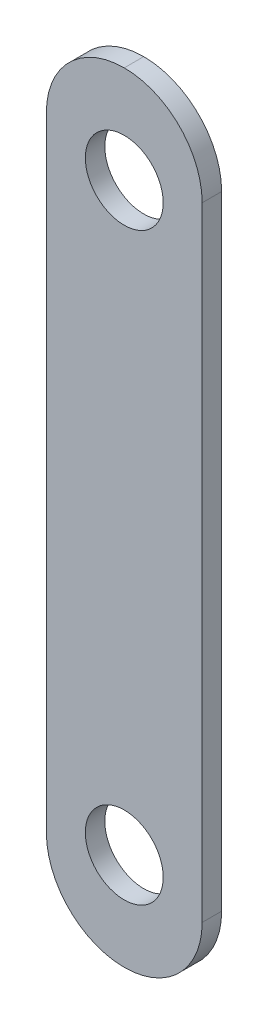
ISO-10303-21;
HEADER;
FILE_DESCRIPTION(('STEP AP214'),'2;1');
FILE_NAME('part.step','',(''),(''),'','','');
FILE_SCHEMA(('AUTOMOTIVE_DESIGN { 1 0 10303 214 1 1 1 1 }'));
ENDSEC;
DATA;
#1=APPLICATION_CONTEXT('core data for automotive mechanical design processes');
#2=APPLICATION_PROTOCOL_DEFINITION('international standard','automotive_design',2000,#1);
#3=PRODUCT_CONTEXT('',#1,'mechanical');
#4=PRODUCT('Part','Part','',(#3));
#5=PRODUCT_RELATED_PRODUCT_CATEGORY('part','',(#4));
#6=PRODUCT_DEFINITION_FORMATION('','',#4);
#7=PRODUCT_DEFINITION_CONTEXT('part definition',#1,'design');
#8=PRODUCT_DEFINITION('design','',#6,#7);
#9=PRODUCT_DEFINITION_SHAPE('','',#8);
#10=(LENGTH_UNIT() NAMED_UNIT(*) SI_UNIT(.MILLI.,.METRE.));
#11=(NAMED_UNIT(*) PLANE_ANGLE_UNIT() SI_UNIT($,.RADIAN.));
#12=(NAMED_UNIT(*) SI_UNIT($,.STERADIAN.) SOLID_ANGLE_UNIT());
#13=UNCERTAINTY_MEASURE_WITH_UNIT(LENGTH_MEASURE(1.E-05),#10,'distance_accuracy_value','');
#14=(GEOMETRIC_REPRESENTATION_CONTEXT(3) GLOBAL_UNCERTAINTY_ASSIGNED_CONTEXT((#13)) GLOBAL_UNIT_ASSIGNED_CONTEXT((#10,
#11,#12)) REPRESENTATION_CONTEXT('',''));
#15=CARTESIAN_POINT('',(0.,0.,0.));
#16=DIRECTION('',(0.,0.,1.));
#17=DIRECTION('',(1.,0.,0.));
#18=AXIS2_PLACEMENT_3D('',#15,#16,#17);
#19=CARTESIAN_POINT('',(0.,0.,0.5));
#20=DIRECTION('',(0.,0.,1.));
#21=DIRECTION('',(1.,0.,0.));
#22=AXIS2_PLACEMENT_3D('',#19,#20,#21);
#23=PLANE('',#22);
#24=CARTESIAN_POINT('',(2.,17.5,0.5));
#25=DIRECTION('',(0.,0.,1.));
#26=DIRECTION('',(1.,0.,0.));
#27=AXIS2_PLACEMENT_3D('',#24,#25,#26);
#28=CIRCLE('',#27,1.);
#29=CARTESIAN_POINT('',(3.,17.5,0.5));
#30=VERTEX_POINT('',#29);
#31=EDGE_CURVE('E103',#30,#30,#28,.T.);
#32=ORIENTED_EDGE('',*,*,#31,.F.);
#33=EDGE_LOOP('',(#32));
#34=FACE_BOUND('',#33,.T.);
#35=DIRECTION('',(0.,1.,0.));
#36=VECTOR('',#35,1.);
#37=CARTESIAN_POINT('',(4.,0.,0.5));
#38=LINE('',#37,#36);
#39=CARTESIAN_POINT('',(4.,2.,0.5));
#40=VERTEX_POINT('',#39);
#41=CARTESIAN_POINT('',(4.,18.,0.5));
#42=VERTEX_POINT('',#41);
#43=EDGE_CURVE('E97',#40,#42,#38,.T.);
#44=ORIENTED_EDGE('',*,*,#43,.T.);
#45=CARTESIAN_POINT('',(2.,18.,0.5));
#46=DIRECTION('',(0.,0.,1.));
#47=DIRECTION('',(1.,0.,0.));
#48=AXIS2_PLACEMENT_3D('',#45,#46,#47);
#49=CIRCLE('',#48,2.);
#50=CARTESIAN_POINT('',(2.,20.,0.5));
#51=VERTEX_POINT('',#50);
#52=EDGE_CURVE('E11',#42,#51,#49,.T.);
#53=ORIENTED_EDGE('',*,*,#52,.T.);
#54=CARTESIAN_POINT('',(2.,18.,0.5));
#55=DIRECTION('',(0.,0.,1.));
#56=DIRECTION('',(1.,0.,0.));
#57=AXIS2_PLACEMENT_3D('',#54,#55,#56);
#58=CIRCLE('',#57,2.);
#59=CARTESIAN_POINT('',(0.,18.,0.5));
#60=VERTEX_POINT('',#59);
#61=EDGE_CURVE('E130',#51,#60,#58,.T.);
#62=ORIENTED_EDGE('',*,*,#61,.T.);
#63=DIRECTION('',(0.,-1.,0.));
#64=VECTOR('',#63,1.);
#65=CARTESIAN_POINT('',(0.,0.,0.5));
#66=LINE('',#65,#64);
#67=CARTESIAN_POINT('',(0.,2.,0.5));
#68=VERTEX_POINT('',#67);
#69=EDGE_CURVE('E98',#60,#68,#66,.T.);
#70=ORIENTED_EDGE('',*,*,#69,.T.);
#71=CARTESIAN_POINT('',(2.,2.,0.5));
#72=DIRECTION('',(0.,0.,1.));
#73=DIRECTION('',(1.,0.,0.));
#74=AXIS2_PLACEMENT_3D('',#71,#72,#73);
#75=CIRCLE('',#74,2.);
#76=CARTESIAN_POINT('',(2.,0.,0.5));
#77=VERTEX_POINT('',#76);
#78=EDGE_CURVE('E120',#68,#77,#75,.T.);
#79=ORIENTED_EDGE('',*,*,#78,.T.);
#80=CARTESIAN_POINT('',(2.,2.,0.5));
#81=DIRECTION('',(0.,0.,1.));
#82=DIRECTION('',(1.,0.,0.));
#83=AXIS2_PLACEMENT_3D('',#80,#81,#82);
#84=CIRCLE('',#83,2.);
#85=EDGE_CURVE('E113',#77,#40,#84,.T.);
#86=ORIENTED_EDGE('',*,*,#85,.T.);
#87=EDGE_LOOP('',(#44,#53,#62,#70,#79,#86));
#88=FACE_BOUND('',#87,.T.);
#89=CARTESIAN_POINT('',(2.,2.5,0.5));
#90=DIRECTION('',(0.,0.,1.));
#91=DIRECTION('',(1.,0.,0.));
#92=AXIS2_PLACEMENT_3D('',#89,#90,#91);
#93=CIRCLE('',#92,1.);
#94=CARTESIAN_POINT('',(3.,2.5,0.5));
#95=VERTEX_POINT('',#94);
#96=EDGE_CURVE('E237',#95,#95,#93,.T.);
#97=ORIENTED_EDGE('',*,*,#96,.F.);
#98=EDGE_LOOP('',(#97));
#99=FACE_BOUND('',#98,.T.);
#100=ADVANCED_FACE('F32',(#34,#88,#99),#23,.T.);
#101=CARTESIAN_POINT('',(0.,0.,0.));
#102=DIRECTION('',(0.,0.,1.));
#103=DIRECTION('',(1.,0.,0.));
#104=AXIS2_PLACEMENT_3D('',#101,#102,#103);
#105=PLANE('',#104);
#106=CARTESIAN_POINT('',(2.,17.5,0.));
#107=DIRECTION('',(0.,0.,1.));
#108=DIRECTION('',(1.,0.,0.));
#109=AXIS2_PLACEMENT_3D('',#106,#107,#108);
#110=CIRCLE('',#109,1.);
#111=CARTESIAN_POINT('',(3.,17.5,0.));
#112=VERTEX_POINT('',#111);
#113=EDGE_CURVE('E107',#112,#112,#110,.T.);
#114=ORIENTED_EDGE('',*,*,#113,.T.);
#115=EDGE_LOOP('',(#114));
#116=FACE_BOUND('',#115,.T.);
#117=CARTESIAN_POINT('',(2.,18.,0.));
#118=DIRECTION('',(0.,0.,1.));
#119=DIRECTION('',(1.,0.,0.));
#120=AXIS2_PLACEMENT_3D('',#117,#118,#119);
#121=CIRCLE('',#120,2.);
#122=CARTESIAN_POINT('',(0.,18.,0.));
#123=VERTEX_POINT('',#122);
#124=CARTESIAN_POINT('',(2.,20.,0.));
#125=VERTEX_POINT('',#124);
#126=EDGE_CURVE('E125',#123,#125,#121,.F.);
#127=ORIENTED_EDGE('',*,*,#126,.T.);
#128=CARTESIAN_POINT('',(2.,18.,0.));
#129=DIRECTION('',(0.,0.,1.));
#130=DIRECTION('',(1.,0.,0.));
#131=AXIS2_PLACEMENT_3D('',#128,#129,#130);
#132=CIRCLE('',#131,2.);
#133=CARTESIAN_POINT('',(4.,18.,0.));
#134=VERTEX_POINT('',#133);
#135=EDGE_CURVE('E54',#125,#134,#132,.F.);
#136=ORIENTED_EDGE('',*,*,#135,.T.);
#137=DIRECTION('',(0.,1.,0.));
#138=VECTOR('',#137,1.);
#139=CARTESIAN_POINT('',(4.,0.,0.));
#140=LINE('',#139,#138);
#141=CARTESIAN_POINT('',(4.,2.,0.));
#142=VERTEX_POINT('',#141);
#143=EDGE_CURVE('E96',#142,#134,#140,.T.);
#144=ORIENTED_EDGE('',*,*,#143,.F.);
#145=CARTESIAN_POINT('',(2.,2.,0.));
#146=DIRECTION('',(0.,0.,1.));
#147=DIRECTION('',(1.,0.,0.));
#148=AXIS2_PLACEMENT_3D('',#145,#146,#147);
#149=CIRCLE('',#148,2.);
#150=CARTESIAN_POINT('',(2.,0.,0.));
#151=VERTEX_POINT('',#150);
#152=EDGE_CURVE('E86',#142,#151,#149,.F.);
#153=ORIENTED_EDGE('',*,*,#152,.T.);
#154=CARTESIAN_POINT('',(2.,2.,0.));
#155=DIRECTION('',(0.,0.,1.));
#156=DIRECTION('',(1.,0.,0.));
#157=AXIS2_PLACEMENT_3D('',#154,#155,#156);
#158=CIRCLE('',#157,2.);
#159=CARTESIAN_POINT('',(0.,2.,0.));
#160=VERTEX_POINT('',#159);
#161=EDGE_CURVE('E115',#151,#160,#158,.F.);
#162=ORIENTED_EDGE('',*,*,#161,.T.);
#163=DIRECTION('',(0.,-1.,0.));
#164=VECTOR('',#163,1.);
#165=CARTESIAN_POINT('',(0.,0.,0.));
#166=LINE('',#165,#164);
#167=EDGE_CURVE('E102',#123,#160,#166,.T.);
#168=ORIENTED_EDGE('',*,*,#167,.F.);
#169=EDGE_LOOP('',(#127,#136,#144,#153,#162,#168));
#170=FACE_BOUND('',#169,.T.);
#171=CARTESIAN_POINT('',(2.,2.5,0.));
#172=DIRECTION('',(0.,0.,1.));
#173=DIRECTION('',(1.,0.,0.));
#174=AXIS2_PLACEMENT_3D('',#171,#172,#173);
#175=CIRCLE('',#174,1.);
#176=CARTESIAN_POINT('',(3.,2.5,0.));
#177=VERTEX_POINT('',#176);
#178=EDGE_CURVE('E240',#177,#177,#175,.T.);
#179=ORIENTED_EDGE('',*,*,#178,.T.);
#180=EDGE_LOOP('',(#179));
#181=FACE_BOUND('',#180,.T.);
#182=ADVANCED_FACE('F100',(#116,#170,#181),#105,.F.);
#183=CARTESIAN_POINT('',(4.,0.,0.5));
#184=DIRECTION('',(-1.,0.,0.));
#185=DIRECTION('',(0.,0.,1.));
#186=AXIS2_PLACEMENT_3D('',#183,#184,#185);
#187=PLANE('',#186);
#188=ORIENTED_EDGE('',*,*,#143,.T.);
#189=DIRECTION('',(0.,0.,-1.));
#190=VECTOR('',#189,1.);
#191=CARTESIAN_POINT('',(4.,18.,0.5));
#192=LINE('',#191,#190);
#193=EDGE_CURVE('E40',#134,#42,#192,.F.);
#194=ORIENTED_EDGE('',*,*,#193,.T.);
#195=ORIENTED_EDGE('',*,*,#43,.F.);
#196=DIRECTION('',(0.,0.,-1.));
#197=VECTOR('',#196,1.);
#198=CARTESIAN_POINT('',(4.,2.,0.5));
#199=LINE('',#198,#197);
#200=EDGE_CURVE('E90',#40,#142,#199,.T.);
#201=ORIENTED_EDGE('',*,*,#200,.T.);
#202=EDGE_LOOP('',(#188,#194,#195,#201));
#203=FACE_BOUND('',#202,.T.);
#204=ADVANCED_FACE('F95',(#203),#187,.F.);
#205=CARTESIAN_POINT('',(0.,0.,0.5));
#206=DIRECTION('',(1.,0.,0.));
#207=DIRECTION('',(0.,0.,-1.));
#208=AXIS2_PLACEMENT_3D('',#205,#206,#207);
#209=PLANE('',#208);
#210=ORIENTED_EDGE('',*,*,#69,.F.);
#211=DIRECTION('',(0.,0.,-1.));
#212=VECTOR('',#211,1.);
#213=CARTESIAN_POINT('',(0.,18.,0.5));
#214=LINE('',#213,#212);
#215=EDGE_CURVE('E122',#60,#123,#214,.T.);
#216=ORIENTED_EDGE('',*,*,#215,.T.);
#217=ORIENTED_EDGE('',*,*,#167,.T.);
#218=DIRECTION('',(0.,0.,-1.));
#219=VECTOR('',#218,1.);
#220=CARTESIAN_POINT('',(0.,2.,0.5));
#221=LINE('',#220,#219);
#222=EDGE_CURVE('E117',#160,#68,#221,.F.);
#223=ORIENTED_EDGE('',*,*,#222,.T.);
#224=EDGE_LOOP('',(#210,#216,#217,#223));
#225=FACE_BOUND('',#224,.T.);
#226=ADVANCED_FACE('F141',(#225),#209,.F.);
#227=CARTESIAN_POINT('',(2.,17.5,0.5));
#228=DIRECTION('',(0.,0.,-1.));
#229=DIRECTION('',(-1.,0.,0.));
#230=AXIS2_PLACEMENT_3D('',#227,#228,#229);
#231=CYLINDRICAL_SURFACE('',#230,1.);
#232=ORIENTED_EDGE('',*,*,#31,.T.);
#233=EDGE_LOOP('',(#232));
#234=FACE_BOUND('',#233,.T.);
#235=ORIENTED_EDGE('',*,*,#113,.F.);
#236=EDGE_LOOP('',(#235));
#237=FACE_BOUND('',#236,.T.);
#238=ADVANCED_FACE('F163',(#234,#237),#231,.F.);
#239=CARTESIAN_POINT('',(2.,2.5,0.5));
#240=DIRECTION('',(0.,0.,-1.));
#241=DIRECTION('',(-1.,0.,0.));
#242=AXIS2_PLACEMENT_3D('',#239,#240,#241);
#243=CYLINDRICAL_SURFACE('',#242,1.);
#244=ORIENTED_EDGE('',*,*,#96,.T.);
#245=EDGE_LOOP('',(#244));
#246=FACE_BOUND('',#245,.T.);
#247=ORIENTED_EDGE('',*,*,#178,.F.);
#248=EDGE_LOOP('',(#247));
#249=FACE_BOUND('',#248,.T.);
#250=ADVANCED_FACE('F172',(#246,#249),#243,.F.);
#251=CARTESIAN_POINT('',(2.,2.,0.5));
#252=DIRECTION('',(0.,0.,-1.));
#253=DIRECTION('',(-1.,0.,0.));
#254=AXIS2_PLACEMENT_3D('',#251,#252,#253);
#255=CYLINDRICAL_SURFACE('',#254,2.);
#256=ORIENTED_EDGE('',*,*,#85,.F.);
#257=DIRECTION('',(0.,0.,-1.));
#258=VECTOR('',#257,1.);
#259=CARTESIAN_POINT('',(2.,0.,0.5));
#260=LINE('',#259,#258);
#261=EDGE_CURVE('E92',#151,#77,#260,.F.);
#262=ORIENTED_EDGE('',*,*,#261,.F.);
#263=ORIENTED_EDGE('',*,*,#152,.F.);
#264=ORIENTED_EDGE('',*,*,#200,.F.);
#265=EDGE_LOOP('',(#256,#262,#263,#264));
#266=FACE_BOUND('',#265,.T.);
#267=ADVANCED_FACE('F89',(#266),#255,.T.);
#268=CARTESIAN_POINT('',(2.,2.,0.5));
#269=DIRECTION('',(0.,0.,-1.));
#270=DIRECTION('',(-1.,0.,0.));
#271=AXIS2_PLACEMENT_3D('',#268,#269,#270);
#272=CYLINDRICAL_SURFACE('',#271,2.);
#273=ORIENTED_EDGE('',*,*,#78,.F.);
#274=ORIENTED_EDGE('',*,*,#222,.F.);
#275=ORIENTED_EDGE('',*,*,#161,.F.);
#276=ORIENTED_EDGE('',*,*,#261,.T.);
#277=EDGE_LOOP('',(#273,#274,#275,#276));
#278=FACE_BOUND('',#277,.T.);
#279=ADVANCED_FACE('F147',(#278),#272,.T.);
#280=CARTESIAN_POINT('',(2.,18.,0.5));
#281=DIRECTION('',(0.,0.,-1.));
#282=DIRECTION('',(-1.,0.,0.));
#283=AXIS2_PLACEMENT_3D('',#280,#281,#282);
#284=CYLINDRICAL_SURFACE('',#283,2.);
#285=ORIENTED_EDGE('',*,*,#61,.F.);
#286=DIRECTION('',(0.,0.,-1.));
#287=VECTOR('',#286,1.);
#288=CARTESIAN_POINT('',(2.,20.,0.5));
#289=LINE('',#288,#287);
#290=EDGE_CURVE('E127',#125,#51,#289,.F.);
#291=ORIENTED_EDGE('',*,*,#290,.F.);
#292=ORIENTED_EDGE('',*,*,#126,.F.);
#293=ORIENTED_EDGE('',*,*,#215,.F.);
#294=EDGE_LOOP('',(#285,#291,#292,#293));
#295=FACE_BOUND('',#294,.T.);
#296=ADVANCED_FACE('F145',(#295),#284,.T.);
#297=CARTESIAN_POINT('',(2.,18.,0.5));
#298=DIRECTION('',(0.,0.,-1.));
#299=DIRECTION('',(-1.,0.,0.));
#300=AXIS2_PLACEMENT_3D('',#297,#298,#299);
#301=CYLINDRICAL_SURFACE('',#300,2.);
#302=ORIENTED_EDGE('',*,*,#52,.F.);
#303=ORIENTED_EDGE('',*,*,#193,.F.);
#304=ORIENTED_EDGE('',*,*,#135,.F.);
#305=ORIENTED_EDGE('',*,*,#290,.T.);
#306=EDGE_LOOP('',(#302,#303,#304,#305));
#307=FACE_BOUND('',#306,.T.);
#308=ADVANCED_FACE('F34',(#307),#301,.T.);
#309=CLOSED_SHELL('',(#100,#182,#204,#226,#238,#250,#267,#279,#296,#308));
#310=MANIFOLD_SOLID_BREP('B2',#309);
#311=ADVANCED_BREP_SHAPE_REPRESENTATION('',(#18,#310),#14);
#312=SHAPE_DEFINITION_REPRESENTATION(#9,#311);
ENDSEC;
END-ISO-10303-21;
